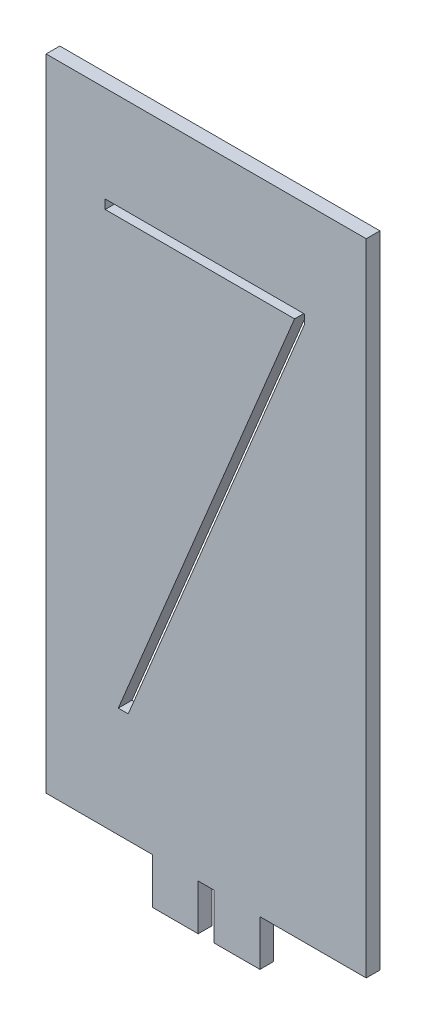
ISO-10303-21;
HEADER;
FILE_DESCRIPTION(('STEP AP214'),'2;1');
FILE_NAME('part.step','',(''),(''),'','','');
FILE_SCHEMA(('AUTOMOTIVE_DESIGN { 1 0 10303 214 1 1 1 1 }'));
ENDSEC;
DATA;
#1=APPLICATION_CONTEXT('core data for automotive mechanical design processes');
#2=APPLICATION_PROTOCOL_DEFINITION('international standard','automotive_design',2000,#1);
#3=PRODUCT_CONTEXT('',#1,'mechanical');
#4=PRODUCT('Part','Part','',(#3));
#5=PRODUCT_RELATED_PRODUCT_CATEGORY('part','',(#4));
#6=PRODUCT_DEFINITION_FORMATION('','',#4);
#7=PRODUCT_DEFINITION_CONTEXT('part definition',#1,'design');
#8=PRODUCT_DEFINITION('design','',#6,#7);
#9=PRODUCT_DEFINITION_SHAPE('','',#8);
#10=(LENGTH_UNIT() NAMED_UNIT(*) SI_UNIT(.MILLI.,.METRE.));
#11=(NAMED_UNIT(*) PLANE_ANGLE_UNIT() SI_UNIT($,.RADIAN.));
#12=(NAMED_UNIT(*) SI_UNIT($,.STERADIAN.) SOLID_ANGLE_UNIT());
#13=UNCERTAINTY_MEASURE_WITH_UNIT(LENGTH_MEASURE(1.E-05),#10,'distance_accuracy_value','');
#14=(GEOMETRIC_REPRESENTATION_CONTEXT(3) GLOBAL_UNCERTAINTY_ASSIGNED_CONTEXT((#13)) GLOBAL_UNIT_ASSIGNED_CONTEXT((#10,
#11,#12)) REPRESENTATION_CONTEXT('',''));
#15=CARTESIAN_POINT('',(0.,0.,0.));
#16=DIRECTION('',(0.,0.,1.));
#17=DIRECTION('',(1.,0.,0.));
#18=AXIS2_PLACEMENT_3D('',#15,#16,#17);
#19=CARTESIAN_POINT('',(0.,0.,1.5));
#20=DIRECTION('',(0.,1.,0.));
#21=DIRECTION('',(0.,0.,1.));
#22=AXIS2_PLACEMENT_3D('',#19,#20,#21);
#23=PLANE('',#22);
#24=DIRECTION('',(1.,0.,0.));
#25=VECTOR('',#24,1.);
#26=CARTESIAN_POINT('',(0.,0.,1.5));
#27=LINE('',#26,#25);
#28=CARTESIAN_POINT('',(11.63,0.,1.5));
#29=VERTEX_POINT('',#28);
#30=CARTESIAN_POINT('',(16.63,0.,1.5));
#31=VERTEX_POINT('',#30);
#32=EDGE_CURVE('E280',#29,#31,#27,.T.);
#33=ORIENTED_EDGE('',*,*,#32,.F.);
#34=DIRECTION('',(0.,0.,1.));
#35=VECTOR('',#34,1.);
#36=CARTESIAN_POINT('',(11.63,0.,0.));
#37=LINE('',#36,#35);
#38=CARTESIAN_POINT('',(11.63,0.,0.));
#39=VERTEX_POINT('',#38);
#40=EDGE_CURVE('E218',#39,#29,#37,.T.);
#41=ORIENTED_EDGE('',*,*,#40,.F.);
#42=DIRECTION('',(1.,0.,0.));
#43=VECTOR('',#42,1.);
#44=CARTESIAN_POINT('',(0.,0.,0.));
#45=LINE('',#44,#43);
#46=CARTESIAN_POINT('',(16.63,0.,0.));
#47=VERTEX_POINT('',#46);
#48=EDGE_CURVE('E291',#39,#47,#45,.T.);
#49=ORIENTED_EDGE('',*,*,#48,.T.);
#50=DIRECTION('',(0.,0.,1.));
#51=VECTOR('',#50,1.);
#52=CARTESIAN_POINT('',(16.63,0.,0.));
#53=LINE('',#52,#51);
#54=EDGE_CURVE('E259',#47,#31,#53,.T.);
#55=ORIENTED_EDGE('',*,*,#54,.T.);
#56=EDGE_LOOP('',(#33,#41,#49,#55));
#57=FACE_BOUND('',#56,.T.);
#58=ADVANCED_FACE('F36',(#57),#23,.F.);
#59=CARTESIAN_POINT('',(0.,0.,1.5));
#60=DIRECTION('',(1.,0.,0.));
#61=DIRECTION('',(0.,1.,0.));
#62=AXIS2_PLACEMENT_3D('',#59,#60,#61);
#63=PLANE('',#62);
#64=DIRECTION('',(0.,-1.,0.));
#65=VECTOR('',#64,1.);
#66=CARTESIAN_POINT('',(0.,0.,0.));
#67=LINE('',#66,#65);
#68=CARTESIAN_POINT('',(0.,75.,0.));
#69=VERTEX_POINT('',#68);
#70=CARTESIAN_POINT('',(0.,5.,0.));
#71=VERTEX_POINT('',#70);
#72=EDGE_CURVE('E227',#69,#71,#67,.T.);
#73=ORIENTED_EDGE('',*,*,#72,.T.);
#74=DIRECTION('',(0.,0.,1.));
#75=VECTOR('',#74,1.);
#76=CARTESIAN_POINT('',(0.,5.,0.));
#77=LINE('',#76,#75);
#78=CARTESIAN_POINT('',(0.,5.,1.5));
#79=VERTEX_POINT('',#78);
#80=EDGE_CURVE('E224',#71,#79,#77,.T.);
#81=ORIENTED_EDGE('',*,*,#80,.T.);
#82=DIRECTION('',(0.,-1.,0.));
#83=VECTOR('',#82,1.);
#84=CARTESIAN_POINT('',(0.,0.,1.5));
#85=LINE('',#84,#83);
#86=CARTESIAN_POINT('',(0.,75.,1.5));
#87=VERTEX_POINT('',#86);
#88=EDGE_CURVE('E273',#87,#79,#85,.T.);
#89=ORIENTED_EDGE('',*,*,#88,.F.);
#90=DIRECTION('',(0.,0.,-1.));
#91=VECTOR('',#90,1.);
#92=CARTESIAN_POINT('',(0.,75.,1.5));
#93=LINE('',#92,#91);
#94=EDGE_CURVE('E285',#87,#69,#93,.T.);
#95=ORIENTED_EDGE('',*,*,#94,.T.);
#96=EDGE_LOOP('',(#73,#81,#89,#95));
#97=FACE_BOUND('',#96,.T.);
#98=ADVANCED_FACE('F38',(#97),#63,.F.);
#99=CARTESIAN_POINT('',(18.38,0.,0.));
#100=VERTEX_POINT('',#99);
#101=CARTESIAN_POINT('',(23.38,0.,0.));
#102=VERTEX_POINT('',#101);
#103=EDGE_CURVE('E288',#100,#102,#45,.T.);
#104=ORIENTED_EDGE('',*,*,#103,.T.);
#105=DIRECTION('',(0.,0.,1.));
#106=VECTOR('',#105,1.);
#107=CARTESIAN_POINT('',(23.38,0.,0.));
#108=LINE('',#107,#106);
#109=CARTESIAN_POINT('',(23.38,0.,1.5));
#110=VERTEX_POINT('',#109);
#111=EDGE_CURVE('E238',#102,#110,#108,.T.);
#112=ORIENTED_EDGE('',*,*,#111,.T.);
#113=CARTESIAN_POINT('',(18.38,0.,1.5));
#114=VERTEX_POINT('',#113);
#115=EDGE_CURVE('E276',#114,#110,#27,.T.);
#116=ORIENTED_EDGE('',*,*,#115,.F.);
#117=DIRECTION('',(0.,0.,1.));
#118=VECTOR('',#117,1.);
#119=CARTESIAN_POINT('',(18.38,0.,0.));
#120=LINE('',#119,#118);
#121=EDGE_CURVE('E269',#100,#114,#120,.T.);
#122=ORIENTED_EDGE('',*,*,#121,.F.);
#123=EDGE_LOOP('',(#104,#112,#116,#122));
#124=FACE_BOUND('',#123,.T.);
#125=ADVANCED_FACE('F346',(#124),#23,.F.);
#126=CARTESIAN_POINT('',(35.,0.,1.5));
#127=DIRECTION('',(-1.,0.,0.));
#128=DIRECTION('',(0.,-1.,0.));
#129=AXIS2_PLACEMENT_3D('',#126,#127,#128);
#130=PLANE('',#129);
#131=DIRECTION('',(0.,1.,0.));
#132=VECTOR('',#131,1.);
#133=CARTESIAN_POINT('',(35.,0.,1.5));
#134=LINE('',#133,#132);
#135=CARTESIAN_POINT('',(35.,5.,1.5));
#136=VERTEX_POINT('',#135);
#137=CARTESIAN_POINT('',(35.,75.,1.5));
#138=VERTEX_POINT('',#137);
#139=EDGE_CURVE('E281',#136,#138,#134,.T.);
#140=ORIENTED_EDGE('',*,*,#139,.F.);
#141=DIRECTION('',(0.,0.,1.));
#142=VECTOR('',#141,1.);
#143=CARTESIAN_POINT('',(35.,5.,0.));
#144=LINE('',#143,#142);
#145=CARTESIAN_POINT('',(35.,5.,0.));
#146=VERTEX_POINT('',#145);
#147=EDGE_CURVE('E245',#146,#136,#144,.T.);
#148=ORIENTED_EDGE('',*,*,#147,.F.);
#149=DIRECTION('',(0.,1.,0.));
#150=VECTOR('',#149,1.);
#151=CARTESIAN_POINT('',(35.,0.,0.));
#152=LINE('',#151,#150);
#153=CARTESIAN_POINT('',(35.,75.,0.));
#154=VERTEX_POINT('',#153);
#155=EDGE_CURVE('E292',#146,#154,#152,.T.);
#156=ORIENTED_EDGE('',*,*,#155,.T.);
#157=DIRECTION('',(0.,0.,-1.));
#158=VECTOR('',#157,1.);
#159=CARTESIAN_POINT('',(35.,75.,1.5));
#160=LINE('',#159,#158);
#161=EDGE_CURVE('E297',#138,#154,#160,.T.);
#162=ORIENTED_EDGE('',*,*,#161,.F.);
#163=EDGE_LOOP('',(#140,#148,#156,#162));
#164=FACE_BOUND('',#163,.T.);
#165=ADVANCED_FACE('F354',(#164),#130,.F.);
#166=CARTESIAN_POINT('',(0.,75.,1.5));
#167=DIRECTION('',(0.,-1.,0.));
#168=DIRECTION('',(0.,0.,-1.));
#169=AXIS2_PLACEMENT_3D('',#166,#167,#168);
#170=PLANE('',#169);
#171=DIRECTION('',(-1.,0.,0.));
#172=VECTOR('',#171,1.);
#173=CARTESIAN_POINT('',(0.,75.,0.));
#174=LINE('',#173,#172);
#175=EDGE_CURVE('E277',#154,#69,#174,.T.);
#176=ORIENTED_EDGE('',*,*,#175,.T.);
#177=ORIENTED_EDGE('',*,*,#94,.F.);
#178=DIRECTION('',(-1.,0.,0.));
#179=VECTOR('',#178,1.);
#180=CARTESIAN_POINT('',(0.,75.,1.5));
#181=LINE('',#180,#179);
#182=EDGE_CURVE('E283',#138,#87,#181,.T.);
#183=ORIENTED_EDGE('',*,*,#182,.F.);
#184=ORIENTED_EDGE('',*,*,#161,.T.);
#185=EDGE_LOOP('',(#176,#177,#183,#184));
#186=FACE_BOUND('',#185,.T.);
#187=ADVANCED_FACE('F359',(#186),#170,.F.);
#188=CARTESIAN_POINT('',(0.,0.,1.5));
#189=DIRECTION('',(0.,0.,-1.));
#190=DIRECTION('',(-1.,0.,0.));
#191=AXIS2_PLACEMENT_3D('',#188,#189,#190);
#192=PLANE('',#191);
#193=DIRECTION('',(1.,0.,0.));
#194=VECTOR('',#193,1.);
#195=CARTESIAN_POINT('',(27.1675061690048,63.5,1.5));
#196=LINE('',#195,#194);
#197=CARTESIAN_POINT('',(6.45924065450965,63.5,1.5));
#198=VERTEX_POINT('',#197);
#199=CARTESIAN_POINT('',(27.1675061690048,63.5,1.5));
#200=VERTEX_POINT('',#199);
#201=EDGE_CURVE('E178',#198,#200,#196,.T.);
#202=ORIENTED_EDGE('',*,*,#201,.F.);
#203=DIRECTION('',(0.,-1.,0.));
#204=VECTOR('',#203,1.);
#205=CARTESIAN_POINT('',(6.45924065450965,63.5,1.5));
#206=LINE('',#205,#204);
#207=CARTESIAN_POINT('',(6.45924065450965,64.5,1.5));
#208=VERTEX_POINT('',#207);
#209=EDGE_CURVE('E51',#208,#198,#206,.T.);
#210=ORIENTED_EDGE('',*,*,#209,.F.);
#211=DIRECTION('',(-1.,0.,0.));
#212=VECTOR('',#211,1.);
#213=CARTESIAN_POINT('',(6.45924065450965,64.5,1.5));
#214=LINE('',#213,#212);
#215=CARTESIAN_POINT('',(28.25,64.5,1.5));
#216=VERTEX_POINT('',#215);
#217=EDGE_CURVE('E197',#216,#208,#214,.T.);
#218=ORIENTED_EDGE('',*,*,#217,.F.);
#219=DIRECTION('',(0.,1.,0.));
#220=VECTOR('',#219,1.);
#221=CARTESIAN_POINT('',(28.25,64.5,1.5));
#222=LINE('',#221,#220);
#223=CARTESIAN_POINT('',(28.25,63.5,1.5));
#224=VERTEX_POINT('',#223);
#225=EDGE_CURVE('E194',#224,#216,#222,.T.);
#226=ORIENTED_EDGE('',*,*,#225,.F.);
#227=DIRECTION('',(0.382892771956685,0.923792793424654,0.));
#228=VECTOR('',#227,1.);
#229=CARTESIAN_POINT('',(28.25,63.5,1.5));
#230=LINE('',#229,#228);
#231=CARTESIAN_POINT('',(8.97672354372722,17.,1.5));
#232=VERTEX_POINT('',#231);
#233=EDGE_CURVE('E188',#232,#224,#230,.T.);
#234=ORIENTED_EDGE('',*,*,#233,.F.);
#235=DIRECTION('',(1.,0.,0.));
#236=VECTOR('',#235,1.);
#237=CARTESIAN_POINT('',(8.97672354372722,17.,1.5));
#238=LINE('',#237,#236);
#239=CARTESIAN_POINT('',(7.89422971273203,17.,1.5));
#240=VERTEX_POINT('',#239);
#241=EDGE_CURVE('E186',#240,#232,#238,.T.);
#242=ORIENTED_EDGE('',*,*,#241,.F.);
#243=DIRECTION('',(-0.382892771956685,-0.923792793424654,0.));
#244=VECTOR('',#243,1.);
#245=CARTESIAN_POINT('',(7.89422971273203,17.,1.5));
#246=LINE('',#245,#244);
#247=EDGE_CURVE('E169',#200,#240,#246,.T.);
#248=ORIENTED_EDGE('',*,*,#247,.F.);
#249=EDGE_LOOP('',(#202,#210,#218,#226,#234,#242,#248));
#250=FACE_BOUND('',#249,.T.);
#251=ORIENTED_EDGE('',*,*,#88,.T.);
#252=DIRECTION('',(-1.,0.,0.));
#253=VECTOR('',#252,1.);
#254=CARTESIAN_POINT('',(0.,5.,1.5));
#255=LINE('',#254,#253);
#256=CARTESIAN_POINT('',(11.63,5.,1.5));
#257=VERTEX_POINT('',#256);
#258=EDGE_CURVE('E215',#257,#79,#255,.T.);
#259=ORIENTED_EDGE('',*,*,#258,.F.);
#260=DIRECTION('',(0.,1.,0.));
#261=VECTOR('',#260,1.);
#262=CARTESIAN_POINT('',(11.63,0.,1.5));
#263=LINE('',#262,#261);
#264=EDGE_CURVE('E219',#29,#257,#263,.T.);
#265=ORIENTED_EDGE('',*,*,#264,.F.);
#266=ORIENTED_EDGE('',*,*,#32,.T.);
#267=DIRECTION('',(0.,-1.,0.));
#268=VECTOR('',#267,1.);
#269=CARTESIAN_POINT('',(16.63,0.,1.5));
#270=LINE('',#269,#268);
#271=CARTESIAN_POINT('',(16.63,5.,1.5));
#272=VERTEX_POINT('',#271);
#273=EDGE_CURVE('E202',#272,#31,#270,.T.);
#274=ORIENTED_EDGE('',*,*,#273,.F.);
#275=DIRECTION('',(-1.,0.,0.));
#276=VECTOR('',#275,1.);
#277=CARTESIAN_POINT('',(16.63,5.,1.5));
#278=LINE('',#277,#276);
#279=CARTESIAN_POINT('',(18.38,5.,1.5));
#280=VERTEX_POINT('',#279);
#281=EDGE_CURVE('E253',#280,#272,#278,.T.);
#282=ORIENTED_EDGE('',*,*,#281,.F.);
#283=DIRECTION('',(0.,1.,0.));
#284=VECTOR('',#283,1.);
#285=CARTESIAN_POINT('',(18.38,0.,1.5));
#286=LINE('',#285,#284);
#287=EDGE_CURVE('E261',#114,#280,#286,.T.);
#288=ORIENTED_EDGE('',*,*,#287,.F.);
#289=ORIENTED_EDGE('',*,*,#115,.T.);
#290=DIRECTION('',(0.,-1.,0.));
#291=VECTOR('',#290,1.);
#292=CARTESIAN_POINT('',(23.38,5.,1.5));
#293=LINE('',#292,#291);
#294=CARTESIAN_POINT('',(23.38,5.,1.5));
#295=VERTEX_POINT('',#294);
#296=EDGE_CURVE('E239',#295,#110,#293,.T.);
#297=ORIENTED_EDGE('',*,*,#296,.F.);
#298=DIRECTION('',(-1.,0.,0.));
#299=VECTOR('',#298,1.);
#300=CARTESIAN_POINT('',(23.38,5.,1.5));
#301=LINE('',#300,#299);
#302=EDGE_CURVE('E235',#136,#295,#301,.T.);
#303=ORIENTED_EDGE('',*,*,#302,.F.);
#304=ORIENTED_EDGE('',*,*,#139,.T.);
#305=ORIENTED_EDGE('',*,*,#182,.T.);
#306=EDGE_LOOP('',(#251,#259,#265,#266,#274,#282,#288,#289,#297,#303,#304,#305));
#307=FACE_BOUND('',#306,.T.);
#308=ADVANCED_FACE('F182',(#250,#307),#192,.F.);
#309=CARTESIAN_POINT('',(0.,0.,0.));
#310=DIRECTION('',(0.,0.,-1.));
#311=DIRECTION('',(-1.,0.,0.));
#312=AXIS2_PLACEMENT_3D('',#309,#310,#311);
#313=PLANE('',#312);
#314=DIRECTION('',(0.,1.,0.));
#315=VECTOR('',#314,1.);
#316=CARTESIAN_POINT('',(6.45924065450965,0.,0.));
#317=LINE('',#316,#315);
#318=CARTESIAN_POINT('',(6.45924065450965,63.5,0.));
#319=VERTEX_POINT('',#318);
#320=CARTESIAN_POINT('',(6.45924065450965,64.5,0.));
#321=VERTEX_POINT('',#320);
#322=EDGE_CURVE('E11',#319,#321,#317,.T.);
#323=ORIENTED_EDGE('',*,*,#322,.F.);
#324=DIRECTION('',(-1.,0.,0.));
#325=VECTOR('',#324,1.);
#326=CARTESIAN_POINT('',(0.,63.5,0.));
#327=LINE('',#326,#325);
#328=CARTESIAN_POINT('',(27.1675061690048,63.5,0.));
#329=VERTEX_POINT('',#328);
#330=EDGE_CURVE('E300',#329,#319,#327,.T.);
#331=ORIENTED_EDGE('',*,*,#330,.F.);
#332=DIRECTION('',(0.382892771956685,0.923792793424654,0.));
#333=VECTOR('',#332,1.);
#334=CARTESIAN_POINT('',(0.723750447867871,-0.299979407894811,0.));
#335=LINE('',#334,#333);
#336=CARTESIAN_POINT('',(7.89422971273203,17.,0.));
#337=VERTEX_POINT('',#336);
#338=EDGE_CURVE('E172',#337,#329,#335,.T.);
#339=ORIENTED_EDGE('',*,*,#338,.F.);
#340=DIRECTION('',(-1.,0.,0.));
#341=VECTOR('',#340,1.);
#342=CARTESIAN_POINT('',(0.,17.,0.));
#343=LINE('',#342,#341);
#344=CARTESIAN_POINT('',(8.97672354372722,17.,0.));
#345=VERTEX_POINT('',#344);
#346=EDGE_CURVE('E303',#345,#337,#343,.T.);
#347=ORIENTED_EDGE('',*,*,#346,.F.);
#348=DIRECTION('',(-0.382892771956685,-0.923792793424654,0.));
#349=VECTOR('',#348,1.);
#350=CARTESIAN_POINT('',(1.64754324129254,-0.682872179851502,0.));
#351=LINE('',#350,#349);
#352=CARTESIAN_POINT('',(28.25,63.5,0.));
#353=VERTEX_POINT('',#352);
#354=EDGE_CURVE('E305',#353,#345,#351,.T.);
#355=ORIENTED_EDGE('',*,*,#354,.F.);
#356=DIRECTION('',(0.,-1.,0.));
#357=VECTOR('',#356,1.);
#358=CARTESIAN_POINT('',(28.25,0.,0.));
#359=LINE('',#358,#357);
#360=CARTESIAN_POINT('',(28.25,64.5,0.));
#361=VERTEX_POINT('',#360);
#362=EDGE_CURVE('E307',#361,#353,#359,.T.);
#363=ORIENTED_EDGE('',*,*,#362,.F.);
#364=DIRECTION('',(1.,0.,0.));
#365=VECTOR('',#364,1.);
#366=CARTESIAN_POINT('',(0.,64.5,0.));
#367=LINE('',#366,#365);
#368=EDGE_CURVE('E44',#321,#361,#367,.T.);
#369=ORIENTED_EDGE('',*,*,#368,.F.);
#370=EDGE_LOOP('',(#323,#331,#339,#347,#355,#363,#369));
#371=FACE_BOUND('',#370,.T.);
#372=DIRECTION('',(-1.,0.,0.));
#373=VECTOR('',#372,1.);
#374=CARTESIAN_POINT('',(0.,5.,0.));
#375=LINE('',#374,#373);
#376=CARTESIAN_POINT('',(11.63,5.,0.));
#377=VERTEX_POINT('',#376);
#378=EDGE_CURVE('E214',#377,#71,#375,.T.);
#379=ORIENTED_EDGE('',*,*,#378,.T.);
#380=ORIENTED_EDGE('',*,*,#72,.F.);
#381=ORIENTED_EDGE('',*,*,#175,.F.);
#382=ORIENTED_EDGE('',*,*,#155,.F.);
#383=DIRECTION('',(-1.,0.,0.));
#384=VECTOR('',#383,1.);
#385=CARTESIAN_POINT('',(23.38,5.,0.));
#386=LINE('',#385,#384);
#387=CARTESIAN_POINT('',(23.38,5.,0.));
#388=VERTEX_POINT('',#387);
#389=EDGE_CURVE('E234',#146,#388,#386,.T.);
#390=ORIENTED_EDGE('',*,*,#389,.T.);
#391=DIRECTION('',(0.,-1.,0.));
#392=VECTOR('',#391,1.);
#393=CARTESIAN_POINT('',(23.38,5.,0.));
#394=LINE('',#393,#392);
#395=EDGE_CURVE('E231',#388,#102,#394,.T.);
#396=ORIENTED_EDGE('',*,*,#395,.T.);
#397=ORIENTED_EDGE('',*,*,#103,.F.);
#398=DIRECTION('',(0.,1.,0.));
#399=VECTOR('',#398,1.);
#400=CARTESIAN_POINT('',(18.38,0.,0.));
#401=LINE('',#400,#399);
#402=CARTESIAN_POINT('',(18.38,5.,0.));
#403=VERTEX_POINT('',#402);
#404=EDGE_CURVE('E252',#100,#403,#401,.T.);
#405=ORIENTED_EDGE('',*,*,#404,.T.);
#406=DIRECTION('',(-1.,0.,0.));
#407=VECTOR('',#406,1.);
#408=CARTESIAN_POINT('',(16.63,5.,0.));
#409=LINE('',#408,#407);
#410=CARTESIAN_POINT('',(16.63,5.,0.));
#411=VERTEX_POINT('',#410);
#412=EDGE_CURVE('E256',#403,#411,#409,.T.);
#413=ORIENTED_EDGE('',*,*,#412,.T.);
#414=DIRECTION('',(0.,-1.,0.));
#415=VECTOR('',#414,1.);
#416=CARTESIAN_POINT('',(16.63,0.,0.));
#417=LINE('',#416,#415);
#418=EDGE_CURVE('E249',#411,#47,#417,.T.);
#419=ORIENTED_EDGE('',*,*,#418,.T.);
#420=ORIENTED_EDGE('',*,*,#48,.F.);
#421=DIRECTION('',(0.,1.,0.));
#422=VECTOR('',#421,1.);
#423=CARTESIAN_POINT('',(11.63,0.,0.));
#424=LINE('',#423,#422);
#425=EDGE_CURVE('E211',#39,#377,#424,.T.);
#426=ORIENTED_EDGE('',*,*,#425,.T.);
#427=EDGE_LOOP('',(#379,#380,#381,#382,#390,#396,#397,#405,#413,#419,#420,#426));
#428=FACE_BOUND('',#427,.T.);
#429=ADVANCED_FACE('F322',(#371,#428),#313,.T.);
#430=CARTESIAN_POINT('',(16.63,0.,0.));
#431=DIRECTION('',(-1.,0.,0.));
#432=DIRECTION('',(0.,0.,1.));
#433=AXIS2_PLACEMENT_3D('',#430,#431,#432);
#434=PLANE('',#433);
#435=ORIENTED_EDGE('',*,*,#273,.T.);
#436=ORIENTED_EDGE('',*,*,#54,.F.);
#437=ORIENTED_EDGE('',*,*,#418,.F.);
#438=DIRECTION('',(0.,0.,1.));
#439=VECTOR('',#438,1.);
#440=CARTESIAN_POINT('',(16.63,5.,0.));
#441=LINE('',#440,#439);
#442=EDGE_CURVE('E241',#411,#272,#441,.T.);
#443=ORIENTED_EDGE('',*,*,#442,.T.);
#444=EDGE_LOOP('',(#435,#436,#437,#443));
#445=FACE_BOUND('',#444,.T.);
#446=ADVANCED_FACE('F407',(#445),#434,.F.);
#447=CARTESIAN_POINT('',(16.63,5.,0.));
#448=DIRECTION('',(0.,1.,0.));
#449=DIRECTION('',(0.,0.,1.));
#450=AXIS2_PLACEMENT_3D('',#447,#448,#449);
#451=PLANE('',#450);
#452=ORIENTED_EDGE('',*,*,#281,.T.);
#453=ORIENTED_EDGE('',*,*,#442,.F.);
#454=ORIENTED_EDGE('',*,*,#412,.F.);
#455=DIRECTION('',(0.,0.,1.));
#456=VECTOR('',#455,1.);
#457=CARTESIAN_POINT('',(18.38,5.,0.));
#458=LINE('',#457,#456);
#459=EDGE_CURVE('E267',#403,#280,#458,.T.);
#460=ORIENTED_EDGE('',*,*,#459,.T.);
#461=EDGE_LOOP('',(#452,#453,#454,#460));
#462=FACE_BOUND('',#461,.T.);
#463=ADVANCED_FACE('F381',(#462),#451,.F.);
#464=CARTESIAN_POINT('',(18.38,0.,0.));
#465=DIRECTION('',(1.,0.,0.));
#466=DIRECTION('',(0.,0.,-1.));
#467=AXIS2_PLACEMENT_3D('',#464,#465,#466);
#468=PLANE('',#467);
#469=ORIENTED_EDGE('',*,*,#287,.T.);
#470=ORIENTED_EDGE('',*,*,#459,.F.);
#471=ORIENTED_EDGE('',*,*,#404,.F.);
#472=ORIENTED_EDGE('',*,*,#121,.T.);
#473=EDGE_LOOP('',(#469,#470,#471,#472));
#474=FACE_BOUND('',#473,.T.);
#475=ADVANCED_FACE('F379',(#474),#468,.F.);
#476=CARTESIAN_POINT('',(23.38,5.,0.));
#477=DIRECTION('',(-1.,0.,0.));
#478=DIRECTION('',(0.,0.,1.));
#479=AXIS2_PLACEMENT_3D('',#476,#477,#478);
#480=PLANE('',#479);
#481=ORIENTED_EDGE('',*,*,#296,.T.);
#482=ORIENTED_EDGE('',*,*,#111,.F.);
#483=ORIENTED_EDGE('',*,*,#395,.F.);
#484=DIRECTION('',(0.,0.,1.));
#485=VECTOR('',#484,1.);
#486=CARTESIAN_POINT('',(23.38,5.,0.));
#487=LINE('',#486,#485);
#488=EDGE_CURVE('E222',#388,#295,#487,.T.);
#489=ORIENTED_EDGE('',*,*,#488,.T.);
#490=EDGE_LOOP('',(#481,#482,#483,#489));
#491=FACE_BOUND('',#490,.T.);
#492=ADVANCED_FACE('F367',(#491),#480,.F.);
#493=CARTESIAN_POINT('',(23.38,5.,0.));
#494=DIRECTION('',(0.,1.,0.));
#495=DIRECTION('',(0.,0.,1.));
#496=AXIS2_PLACEMENT_3D('',#493,#494,#495);
#497=PLANE('',#496);
#498=ORIENTED_EDGE('',*,*,#302,.T.);
#499=ORIENTED_EDGE('',*,*,#488,.F.);
#500=ORIENTED_EDGE('',*,*,#389,.F.);
#501=ORIENTED_EDGE('',*,*,#147,.T.);
#502=EDGE_LOOP('',(#498,#499,#500,#501));
#503=FACE_BOUND('',#502,.T.);
#504=ADVANCED_FACE('F369',(#503),#497,.F.);
#505=CARTESIAN_POINT('',(0.,5.,0.));
#506=DIRECTION('',(0.,1.,0.));
#507=DIRECTION('',(0.,0.,1.));
#508=AXIS2_PLACEMENT_3D('',#505,#506,#507);
#509=PLANE('',#508);
#510=ORIENTED_EDGE('',*,*,#258,.T.);
#511=ORIENTED_EDGE('',*,*,#80,.F.);
#512=ORIENTED_EDGE('',*,*,#378,.F.);
#513=DIRECTION('',(0.,0.,1.));
#514=VECTOR('',#513,1.);
#515=CARTESIAN_POINT('',(11.63,5.,0.));
#516=LINE('',#515,#514);
#517=EDGE_CURVE('E228',#377,#257,#516,.T.);
#518=ORIENTED_EDGE('',*,*,#517,.T.);
#519=EDGE_LOOP('',(#510,#511,#512,#518));
#520=FACE_BOUND('',#519,.T.);
#521=ADVANCED_FACE('F339',(#520),#509,.F.);
#522=CARTESIAN_POINT('',(11.63,0.,0.));
#523=DIRECTION('',(1.,0.,0.));
#524=DIRECTION('',(0.,1.,0.));
#525=AXIS2_PLACEMENT_3D('',#522,#523,#524);
#526=PLANE('',#525);
#527=ORIENTED_EDGE('',*,*,#264,.T.);
#528=ORIENTED_EDGE('',*,*,#517,.F.);
#529=ORIENTED_EDGE('',*,*,#425,.F.);
#530=ORIENTED_EDGE('',*,*,#40,.T.);
#531=EDGE_LOOP('',(#527,#528,#529,#530));
#532=FACE_BOUND('',#531,.T.);
#533=ADVANCED_FACE('F332',(#532),#526,.F.);
#534=CARTESIAN_POINT('',(6.45924065450965,63.5,-18.5));
#535=DIRECTION('',(-1.,0.,0.));
#536=DIRECTION('',(0.,0.,1.));
#537=AXIS2_PLACEMENT_3D('',#534,#535,#536);
#538=PLANE('',#537);
#539=ORIENTED_EDGE('',*,*,#322,.T.);
#540=DIRECTION('',(0.,0.,1.));
#541=VECTOR('',#540,1.);
#542=CARTESIAN_POINT('',(6.45924065450965,64.5,-18.5));
#543=LINE('',#542,#541);
#544=EDGE_CURVE('E200',#321,#208,#543,.T.);
#545=ORIENTED_EDGE('',*,*,#544,.T.);
#546=ORIENTED_EDGE('',*,*,#209,.T.);
#547=DIRECTION('',(0.,0.,1.));
#548=VECTOR('',#547,1.);
#549=CARTESIAN_POINT('',(6.45924065450965,63.5,-18.5));
#550=LINE('',#549,#548);
#551=EDGE_CURVE('E175',#319,#198,#550,.T.);
#552=ORIENTED_EDGE('',*,*,#551,.F.);
#553=EDGE_LOOP('',(#539,#545,#546,#552));
#554=FACE_BOUND('',#553,.T.);
#555=ADVANCED_FACE('F330',(#554),#538,.F.);
#556=CARTESIAN_POINT('',(6.45924065450965,64.5,-18.5));
#557=DIRECTION('',(0.,1.,0.));
#558=DIRECTION('',(0.,0.,1.));
#559=AXIS2_PLACEMENT_3D('',#556,#557,#558);
#560=PLANE('',#559);
#561=ORIENTED_EDGE('',*,*,#368,.T.);
#562=DIRECTION('',(0.,0.,1.));
#563=VECTOR('',#562,1.);
#564=CARTESIAN_POINT('',(28.25,64.5,-18.5));
#565=LINE('',#564,#563);
#566=EDGE_CURVE('E203',#361,#216,#565,.T.);
#567=ORIENTED_EDGE('',*,*,#566,.T.);
#568=ORIENTED_EDGE('',*,*,#217,.T.);
#569=ORIENTED_EDGE('',*,*,#544,.F.);
#570=EDGE_LOOP('',(#561,#567,#568,#569));
#571=FACE_BOUND('',#570,.T.);
#572=ADVANCED_FACE('F312',(#571),#560,.F.);
#573=CARTESIAN_POINT('',(28.25,64.5,-18.5));
#574=DIRECTION('',(1.,0.,0.));
#575=DIRECTION('',(0.,0.,-1.));
#576=AXIS2_PLACEMENT_3D('',#573,#574,#575);
#577=PLANE('',#576);
#578=ORIENTED_EDGE('',*,*,#362,.T.);
#579=DIRECTION('',(0.,0.,1.));
#580=VECTOR('',#579,1.);
#581=CARTESIAN_POINT('',(28.25,63.5,-18.5));
#582=LINE('',#581,#580);
#583=EDGE_CURVE('E205',#353,#224,#582,.T.);
#584=ORIENTED_EDGE('',*,*,#583,.T.);
#585=ORIENTED_EDGE('',*,*,#225,.T.);
#586=ORIENTED_EDGE('',*,*,#566,.F.);
#587=EDGE_LOOP('',(#578,#584,#585,#586));
#588=FACE_BOUND('',#587,.T.);
#589=ADVANCED_FACE('F317',(#588),#577,.F.);
#590=CARTESIAN_POINT('',(28.25,63.5,-18.5));
#591=DIRECTION('',(0.923792793424654,-0.382892771956685,0.));
#592=DIRECTION('',(0.382892771956685,0.923792793424654,0.));
#593=AXIS2_PLACEMENT_3D('',#590,#591,#592);
#594=PLANE('',#593);
#595=ORIENTED_EDGE('',*,*,#354,.T.);
#596=DIRECTION('',(0.,0.,1.));
#597=VECTOR('',#596,1.);
#598=CARTESIAN_POINT('',(8.97672354372722,17.,-18.5));
#599=LINE('',#598,#597);
#600=EDGE_CURVE('E207',#345,#232,#599,.T.);
#601=ORIENTED_EDGE('',*,*,#600,.T.);
#602=ORIENTED_EDGE('',*,*,#233,.T.);
#603=ORIENTED_EDGE('',*,*,#583,.F.);
#604=EDGE_LOOP('',(#595,#601,#602,#603));
#605=FACE_BOUND('',#604,.T.);
#606=ADVANCED_FACE('F327',(#605),#594,.F.);
#607=CARTESIAN_POINT('',(8.97672354372722,17.,-18.5));
#608=DIRECTION('',(0.,-1.,0.));
#609=DIRECTION('',(0.,0.,-1.));
#610=AXIS2_PLACEMENT_3D('',#607,#608,#609);
#611=PLANE('',#610);
#612=ORIENTED_EDGE('',*,*,#346,.T.);
#613=DIRECTION('',(0.,0.,1.));
#614=VECTOR('',#613,1.);
#615=CARTESIAN_POINT('',(7.89422971273203,17.,-18.5));
#616=LINE('',#615,#614);
#617=EDGE_CURVE('E174',#337,#240,#616,.T.);
#618=ORIENTED_EDGE('',*,*,#617,.T.);
#619=ORIENTED_EDGE('',*,*,#241,.T.);
#620=ORIENTED_EDGE('',*,*,#600,.F.);
#621=EDGE_LOOP('',(#612,#618,#619,#620));
#622=FACE_BOUND('',#621,.T.);
#623=ADVANCED_FACE('F329',(#622),#611,.F.);
#624=CARTESIAN_POINT('',(7.89422971273203,17.,-18.5));
#625=DIRECTION('',(-0.923792793424654,0.382892771956685,0.));
#626=DIRECTION('',(-0.382892771956685,-0.923792793424654,0.));
#627=AXIS2_PLACEMENT_3D('',#624,#625,#626);
#628=PLANE('',#627);
#629=ORIENTED_EDGE('',*,*,#338,.T.);
#630=DIRECTION('',(0.,0.,1.));
#631=VECTOR('',#630,1.);
#632=CARTESIAN_POINT('',(27.1675061690048,63.5,-18.5));
#633=LINE('',#632,#631);
#634=EDGE_CURVE('E59',#329,#200,#633,.T.);
#635=ORIENTED_EDGE('',*,*,#634,.T.);
#636=ORIENTED_EDGE('',*,*,#247,.T.);
#637=ORIENTED_EDGE('',*,*,#617,.F.);
#638=EDGE_LOOP('',(#629,#635,#636,#637));
#639=FACE_BOUND('',#638,.T.);
#640=ADVANCED_FACE('F166',(#639),#628,.F.);
#641=CARTESIAN_POINT('',(27.1675061690048,63.5,-18.5));
#642=DIRECTION('',(0.,-1.,0.));
#643=DIRECTION('',(0.,0.,-1.));
#644=AXIS2_PLACEMENT_3D('',#641,#642,#643);
#645=PLANE('',#644);
#646=ORIENTED_EDGE('',*,*,#330,.T.);
#647=ORIENTED_EDGE('',*,*,#551,.T.);
#648=ORIENTED_EDGE('',*,*,#201,.T.);
#649=ORIENTED_EDGE('',*,*,#634,.F.);
#650=EDGE_LOOP('',(#646,#647,#648,#649));
#651=FACE_BOUND('',#650,.T.);
#652=ADVANCED_FACE('F179',(#651),#645,.F.);
#653=CLOSED_SHELL('',(#58,#98,#125,#165,#187,#308,#429,#446,#463,#475,#492,#504,#521,#533,#555,
#572,#589,#606,#623,#640,#652));
#654=MANIFOLD_SOLID_BREP('B2',#653);
#655=ADVANCED_BREP_SHAPE_REPRESENTATION('',(#18,#654),#14);
#656=SHAPE_DEFINITION_REPRESENTATION(#9,#655);
ENDSEC;
END-ISO-10303-21;
